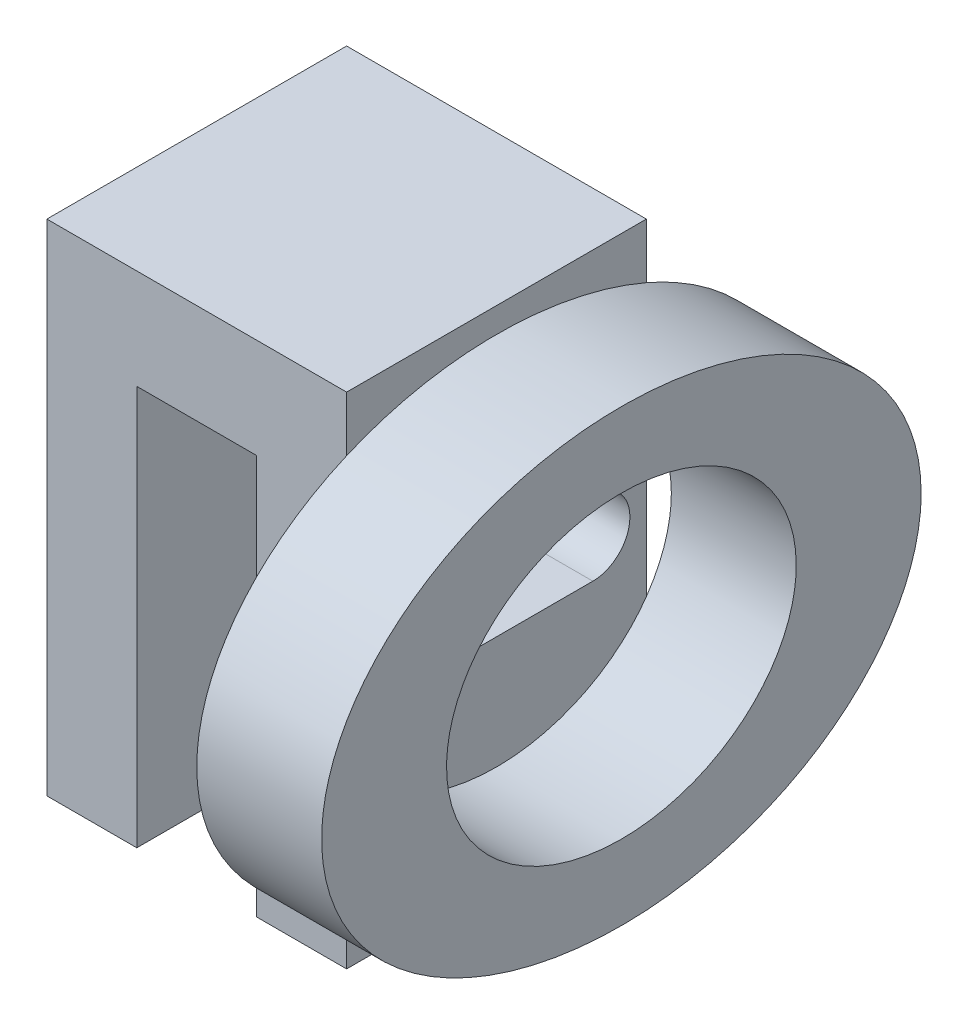
ISO-10303-21;
HEADER;
FILE_DESCRIPTION(('STEP AP214'),'2;1');
FILE_NAME('part.step','',(''),(''),'','','');
FILE_SCHEMA(('AUTOMOTIVE_DESIGN { 1 0 10303 214 1 1 1 1 }'));
ENDSEC;
DATA;
#1=APPLICATION_CONTEXT('core data for automotive mechanical design processes');
#2=APPLICATION_PROTOCOL_DEFINITION('international standard','automotive_design',2000,#1);
#3=PRODUCT_CONTEXT('',#1,'mechanical');
#4=PRODUCT('Part','Part','',(#3));
#5=PRODUCT_RELATED_PRODUCT_CATEGORY('part','',(#4));
#6=PRODUCT_DEFINITION_FORMATION('','',#4);
#7=PRODUCT_DEFINITION_CONTEXT('part definition',#1,'design');
#8=PRODUCT_DEFINITION('design','',#6,#7);
#9=PRODUCT_DEFINITION_SHAPE('','',#8);
#10=(LENGTH_UNIT() NAMED_UNIT(*) SI_UNIT(.MILLI.,.METRE.));
#11=(NAMED_UNIT(*) PLANE_ANGLE_UNIT() SI_UNIT($,.RADIAN.));
#12=(NAMED_UNIT(*) SI_UNIT($,.STERADIAN.) SOLID_ANGLE_UNIT());
#13=UNCERTAINTY_MEASURE_WITH_UNIT(LENGTH_MEASURE(1.E-05),#10,'distance_accuracy_value','');
#14=(GEOMETRIC_REPRESENTATION_CONTEXT(3) GLOBAL_UNCERTAINTY_ASSIGNED_CONTEXT((#13)) GLOBAL_UNIT_ASSIGNED_CONTEXT((#10,
#11,#12)) REPRESENTATION_CONTEXT('',''));
#15=CARTESIAN_POINT('',(0.,0.,0.));
#16=DIRECTION('',(0.,0.,1.));
#17=DIRECTION('',(1.,0.,0.));
#18=AXIS2_PLACEMENT_3D('',#15,#16,#17);
#19=CARTESIAN_POINT('',(0.88785046728972,10.,1.50467289719626));
#20=DIRECTION('',(-1.,0.,0.));
#21=DIRECTION('',(0.,0.,1.));
#22=AXIS2_PLACEMENT_3D('',#19,#20,#21);
#23=PLANE('',#22);
#24=CARTESIAN_POINT('',(0.88785046728972,5.,-1.49532710280374));
#25=DIRECTION('',(1.,0.,0.));
#26=DIRECTION('',(0.,0.,-1.));
#27=AXIS2_PLACEMENT_3D('',#24,#25,#26);
#28=ELLIPSE('',#27,6.,4.5);
#29=CARTESIAN_POINT('',(0.88785046728972,8.89711431702997,-4.49532710280374));
#30=VERTEX_POINT('',#29);
#31=CARTESIAN_POINT('',(0.88785046728972,8.89711431702997,1.50467289719626));
#32=VERTEX_POINT('',#31);
#33=EDGE_CURVE('E240',#30,#32,#28,.T.);
#34=ORIENTED_EDGE('',*,*,#33,.F.);
#35=DIRECTION('',(0.,-1.,0.));
#36=VECTOR('',#35,1.);
#37=CARTESIAN_POINT('',(0.88785046728972,10.,-4.49532710280374));
#38=LINE('',#37,#36);
#39=CARTESIAN_POINT('',(0.88785046728972,10.,-4.49532710280374));
#40=VERTEX_POINT('',#39);
#41=EDGE_CURVE('E304',#40,#30,#38,.T.);
#42=ORIENTED_EDGE('',*,*,#41,.F.);
#43=DIRECTION('',(0.,0.,-1.));
#44=VECTOR('',#43,1.);
#45=CARTESIAN_POINT('',(0.88785046728972,10.,1.50467289719626));
#46=LINE('',#45,#44);
#47=CARTESIAN_POINT('',(0.88785046728972,10.,1.50467289719626));
#48=VERTEX_POINT('',#47);
#49=EDGE_CURVE('E285',#48,#40,#46,.T.);
#50=ORIENTED_EDGE('',*,*,#49,.F.);
#51=DIRECTION('',(0.,-1.,0.));
#52=VECTOR('',#51,1.);
#53=CARTESIAN_POINT('',(0.88785046728972,10.,1.50467289719626));
#54=LINE('',#53,#52);
#55=EDGE_CURVE('E311',#48,#32,#54,.T.);
#56=ORIENTED_EDGE('',*,*,#55,.T.);
#57=EDGE_LOOP('',(#34,#42,#50,#56));
#58=FACE_BOUND('',#57,.T.);
#59=ADVANCED_FACE('F39',(#58),#23,.F.);
#60=CARTESIAN_POINT('',(0.,0.,0.));
#61=DIRECTION('',(0.,1.,0.));
#62=DIRECTION('',(0.,0.,1.));
#63=AXIS2_PLACEMENT_3D('',#60,#61,#62);
#64=PLANE('',#63);
#65=DIRECTION('',(-1.,0.,0.));
#66=VECTOR('',#65,1.);
#67=CARTESIAN_POINT('',(0.88785046728972,0.,-4.49532710280374));
#68=LINE('',#67,#66);
#69=CARTESIAN_POINT('',(-3.31214953271028,0.,-4.49532710280374));
#70=VERTEX_POINT('',#69);
#71=CARTESIAN_POINT('',(-5.11214953271028,0.,-4.49532710280374));
#72=VERTEX_POINT('',#71);
#73=EDGE_CURVE('E273',#70,#72,#68,.T.);
#74=ORIENTED_EDGE('',*,*,#73,.F.);
#75=DIRECTION('',(0.,0.,1.));
#76=VECTOR('',#75,1.);
#77=CARTESIAN_POINT('',(-3.31214953271028,0.,0.));
#78=LINE('',#77,#76);
#79=CARTESIAN_POINT('',(-3.31214953271028,0.,1.50467289719626));
#80=VERTEX_POINT('',#79);
#81=EDGE_CURVE('E328',#70,#80,#78,.T.);
#82=ORIENTED_EDGE('',*,*,#81,.T.);
#83=DIRECTION('',(1.,0.,0.));
#84=VECTOR('',#83,1.);
#85=CARTESIAN_POINT('',(-5.11214953271028,0.,1.50467289719626));
#86=LINE('',#85,#84);
#87=CARTESIAN_POINT('',(-5.11214953271028,0.,1.50467289719626));
#88=VERTEX_POINT('',#87);
#89=EDGE_CURVE('E297',#88,#80,#86,.T.);
#90=ORIENTED_EDGE('',*,*,#89,.F.);
#91=DIRECTION('',(0.,0.,1.));
#92=VECTOR('',#91,1.);
#93=CARTESIAN_POINT('',(-5.11214953271028,0.,-4.49532710280374));
#94=LINE('',#93,#92);
#95=EDGE_CURVE('E293',#72,#88,#94,.T.);
#96=ORIENTED_EDGE('',*,*,#95,.F.);
#97=EDGE_LOOP('',(#74,#82,#90,#96));
#98=FACE_BOUND('',#97,.T.);
#99=ADVANCED_FACE('F377',(#98),#64,.F.);
#100=CARTESIAN_POINT('',(0.88785046728972,10.,-4.49532710280374));
#101=DIRECTION('',(0.,0.,1.));
#102=DIRECTION('',(1.,0.,0.));
#103=AXIS2_PLACEMENT_3D('',#100,#101,#102);
#104=PLANE('',#103);
#105=DIRECTION('',(-1.,0.,0.));
#106=VECTOR('',#105,1.);
#107=CARTESIAN_POINT('',(0.88785046728972,8.,-4.49532710280374));
#108=LINE('',#107,#106);
#109=CARTESIAN_POINT('',(-0.91214953271028,8.,-4.49532710280374));
#110=VERTEX_POINT('',#109);
#111=CARTESIAN_POINT('',(-3.31214953271028,8.,-4.49532710280374));
#112=VERTEX_POINT('',#111);
#113=EDGE_CURVE('E269',#110,#112,#108,.T.);
#114=ORIENTED_EDGE('',*,*,#113,.T.);
#115=DIRECTION('',(0.,-1.,0.));
#116=VECTOR('',#115,1.);
#117=CARTESIAN_POINT('',(-3.31214953271028,10.,-4.49532710280374));
#118=LINE('',#117,#116);
#119=EDGE_CURVE('E265',#112,#70,#118,.T.);
#120=ORIENTED_EDGE('',*,*,#119,.T.);
#121=ORIENTED_EDGE('',*,*,#73,.T.);
#122=DIRECTION('',(0.,-1.,0.));
#123=VECTOR('',#122,1.);
#124=CARTESIAN_POINT('',(-5.11214953271028,10.,-4.49532710280374));
#125=LINE('',#124,#123);
#126=CARTESIAN_POINT('',(-5.11214953271028,10.,-4.49532710280374));
#127=VERTEX_POINT('',#126);
#128=EDGE_CURVE('E321',#127,#72,#125,.T.);
#129=ORIENTED_EDGE('',*,*,#128,.F.);
#130=DIRECTION('',(-1.,0.,0.));
#131=VECTOR('',#130,1.);
#132=CARTESIAN_POINT('',(0.88785046728972,10.,-4.49532710280374));
#133=LINE('',#132,#131);
#134=EDGE_CURVE('E274',#40,#127,#133,.T.);
#135=ORIENTED_EDGE('',*,*,#134,.F.);
#136=ORIENTED_EDGE('',*,*,#41,.T.);
#137=CARTESIAN_POINT('',(0.88785046728972,6.54523626091314,-4.49532710280374));
#138=VERTEX_POINT('',#137);
#139=EDGE_CURVE('E309',#30,#138,#38,.T.);
#140=ORIENTED_EDGE('',*,*,#139,.T.);
#141=CARTESIAN_POINT('',(0.887850467289719,3.45476373908686,-4.49532710280374));
#142=VERTEX_POINT('',#141);
#143=EDGE_CURVE('E350',#138,#142,#38,.T.);
#144=ORIENTED_EDGE('',*,*,#143,.T.);
#145=CARTESIAN_POINT('',(0.88785046728972,1.10288568297003,-4.49532710280374));
#146=VERTEX_POINT('',#145);
#147=EDGE_CURVE('E310',#142,#146,#38,.T.);
#148=ORIENTED_EDGE('',*,*,#147,.T.);
#149=CARTESIAN_POINT('',(0.88785046728972,0.,-4.49532710280374));
#150=VERTEX_POINT('',#149);
#151=EDGE_CURVE('E288',#146,#150,#38,.T.);
#152=ORIENTED_EDGE('',*,*,#151,.T.);
#153=CARTESIAN_POINT('',(-0.912149532710279,0.,-4.49532710280374));
#154=VERTEX_POINT('',#153);
#155=EDGE_CURVE('E289',#150,#154,#68,.T.);
#156=ORIENTED_EDGE('',*,*,#155,.T.);
#157=DIRECTION('',(0.,1.,0.));
#158=VECTOR('',#157,1.);
#159=CARTESIAN_POINT('',(-0.912149532710281,10.,-4.49532710280374));
#160=LINE('',#159,#158);
#161=EDGE_CURVE('E259',#154,#110,#160,.T.);
#162=ORIENTED_EDGE('',*,*,#161,.T.);
#163=EDGE_LOOP('',(#114,#120,#121,#129,#135,#136,#140,#144,#148,#152,#156,#162));
#164=FACE_BOUND('',#163,.T.);
#165=ADVANCED_FACE('F41',(#164),#104,.F.);
#166=CARTESIAN_POINT('',(-5.11214953271028,10.,-4.49532710280374));
#167=DIRECTION('',(1.,0.,0.));
#168=DIRECTION('',(0.,0.,-1.));
#169=AXIS2_PLACEMENT_3D('',#166,#167,#168);
#170=PLANE('',#169);
#171=ORIENTED_EDGE('',*,*,#95,.T.);
#172=DIRECTION('',(0.,-1.,0.));
#173=VECTOR('',#172,1.);
#174=CARTESIAN_POINT('',(-5.11214953271028,10.,1.50467289719626));
#175=LINE('',#174,#173);
#176=CARTESIAN_POINT('',(-5.11214953271028,10.,1.50467289719626));
#177=VERTEX_POINT('',#176);
#178=EDGE_CURVE('E315',#177,#88,#175,.T.);
#179=ORIENTED_EDGE('',*,*,#178,.F.);
#180=DIRECTION('',(0.,0.,1.));
#181=VECTOR('',#180,1.);
#182=CARTESIAN_POINT('',(-5.11214953271028,10.,-4.49532710280374));
#183=LINE('',#182,#181);
#184=EDGE_CURVE('E278',#127,#177,#183,.T.);
#185=ORIENTED_EDGE('',*,*,#184,.F.);
#186=ORIENTED_EDGE('',*,*,#128,.T.);
#187=EDGE_LOOP('',(#171,#179,#185,#186));
#188=FACE_BOUND('',#187,.T.);
#189=ADVANCED_FACE('F387',(#188),#170,.F.);
#190=CARTESIAN_POINT('',(-5.11214953271028,10.,1.50467289719626));
#191=DIRECTION('',(0.,0.,-1.));
#192=DIRECTION('',(-1.,0.,0.));
#193=AXIS2_PLACEMENT_3D('',#190,#191,#192);
#194=PLANE('',#193);
#195=ORIENTED_EDGE('',*,*,#89,.T.);
#196=DIRECTION('',(0.,-1.,0.));
#197=VECTOR('',#196,1.);
#198=CARTESIAN_POINT('',(-3.31214953271028,0.,1.50467289719626));
#199=LINE('',#198,#197);
#200=CARTESIAN_POINT('',(-3.31214953271028,8.,1.50467289719626));
#201=VERTEX_POINT('',#200);
#202=EDGE_CURVE('E252',#201,#80,#199,.T.);
#203=ORIENTED_EDGE('',*,*,#202,.F.);
#204=DIRECTION('',(-1.,0.,0.));
#205=VECTOR('',#204,1.);
#206=CARTESIAN_POINT('',(-3.31214953271028,8.,1.50467289719626));
#207=LINE('',#206,#205);
#208=CARTESIAN_POINT('',(-0.91214953271028,8.,1.50467289719626));
#209=VERTEX_POINT('',#208);
#210=EDGE_CURVE('E248',#209,#201,#207,.T.);
#211=ORIENTED_EDGE('',*,*,#210,.F.);
#212=DIRECTION('',(0.,1.,0.));
#213=VECTOR('',#212,1.);
#214=CARTESIAN_POINT('',(-0.91214953271028,8.,1.50467289719626));
#215=LINE('',#214,#213);
#216=CARTESIAN_POINT('',(-0.912149532710279,0.,1.50467289719626));
#217=VERTEX_POINT('',#216);
#218=EDGE_CURVE('E239',#217,#209,#215,.T.);
#219=ORIENTED_EDGE('',*,*,#218,.F.);
#220=CARTESIAN_POINT('',(0.88785046728972,0.,1.50467289719626));
#221=VERTEX_POINT('',#220);
#222=EDGE_CURVE('E296',#217,#221,#86,.T.);
#223=ORIENTED_EDGE('',*,*,#222,.T.);
#224=CARTESIAN_POINT('',(0.88785046728972,1.10288568297003,1.50467289719626));
#225=VERTEX_POINT('',#224);
#226=EDGE_CURVE('E308',#225,#221,#54,.T.);
#227=ORIENTED_EDGE('',*,*,#226,.F.);
#228=CARTESIAN_POINT('',(0.88785046728972,3.45476373908687,1.50467289719626));
#229=VERTEX_POINT('',#228);
#230=EDGE_CURVE('E317',#229,#225,#54,.T.);
#231=ORIENTED_EDGE('',*,*,#230,.F.);
#232=CARTESIAN_POINT('',(0.887850467289719,6.54523626091314,1.50467289719626));
#233=VERTEX_POINT('',#232);
#234=EDGE_CURVE('E399',#233,#229,#54,.T.);
#235=ORIENTED_EDGE('',*,*,#234,.F.);
#236=EDGE_CURVE('E316',#32,#233,#54,.T.);
#237=ORIENTED_EDGE('',*,*,#236,.F.);
#238=ORIENTED_EDGE('',*,*,#55,.F.);
#239=DIRECTION('',(1.,0.,0.));
#240=VECTOR('',#239,1.);
#241=CARTESIAN_POINT('',(-5.11214953271028,10.,1.50467289719626));
#242=LINE('',#241,#240);
#243=EDGE_CURVE('E282',#177,#48,#242,.T.);
#244=ORIENTED_EDGE('',*,*,#243,.F.);
#245=ORIENTED_EDGE('',*,*,#178,.T.);
#246=EDGE_LOOP('',(#195,#203,#211,#219,#223,#227,#231,#235,#237,#238,#244,#245));
#247=FACE_BOUND('',#246,.T.);
#248=ADVANCED_FACE('F381',(#247),#194,.F.);
#249=EDGE_CURVE('E48',#225,#146,#28,.T.);
#250=ORIENTED_EDGE('',*,*,#249,.F.);
#251=ORIENTED_EDGE('',*,*,#226,.T.);
#252=DIRECTION('',(0.,0.,-1.));
#253=VECTOR('',#252,1.);
#254=CARTESIAN_POINT('',(0.88785046728972,0.,1.50467289719626));
#255=LINE('',#254,#253);
#256=EDGE_CURVE('E279',#221,#150,#255,.T.);
#257=ORIENTED_EDGE('',*,*,#256,.T.);
#258=ORIENTED_EDGE('',*,*,#151,.F.);
#259=EDGE_LOOP('',(#250,#251,#257,#258));
#260=FACE_BOUND('',#259,.T.);
#261=ADVANCED_FACE('F357',(#260),#23,.F.);
#262=CARTESIAN_POINT('',(0.,10.,0.));
#263=DIRECTION('',(0.,1.,0.));
#264=DIRECTION('',(0.,0.,1.));
#265=AXIS2_PLACEMENT_3D('',#262,#263,#264);
#266=PLANE('',#265);
#267=ORIENTED_EDGE('',*,*,#134,.T.);
#268=ORIENTED_EDGE('',*,*,#184,.T.);
#269=ORIENTED_EDGE('',*,*,#243,.T.);
#270=ORIENTED_EDGE('',*,*,#49,.T.);
#271=EDGE_LOOP('',(#267,#268,#269,#270));
#272=FACE_BOUND('',#271,.T.);
#273=ADVANCED_FACE('F391',(#272),#266,.T.);
#274=ORIENTED_EDGE('',*,*,#222,.F.);
#275=DIRECTION('',(0.,0.,-1.));
#276=VECTOR('',#275,1.);
#277=CARTESIAN_POINT('',(-0.912149532710279,0.,0.));
#278=LINE('',#277,#276);
#279=EDGE_CURVE('E325',#217,#154,#278,.T.);
#280=ORIENTED_EDGE('',*,*,#279,.T.);
#281=ORIENTED_EDGE('',*,*,#155,.F.);
#282=ORIENTED_EDGE('',*,*,#256,.F.);
#283=EDGE_LOOP('',(#274,#280,#281,#282));
#284=FACE_BOUND('',#283,.T.);
#285=ADVANCED_FACE('F364',(#284),#64,.F.);
#286=CARTESIAN_POINT('',(-3.31214953271028,8.,-8.49532710280374));
#287=DIRECTION('',(0.,1.,0.));
#288=DIRECTION('',(0.,0.,1.));
#289=AXIS2_PLACEMENT_3D('',#286,#287,#288);
#290=PLANE('',#289);
#291=DIRECTION('',(0.,0.,1.));
#292=VECTOR('',#291,1.);
#293=CARTESIAN_POINT('',(-0.91214953271028,8.,-8.49532710280374));
#294=LINE('',#293,#292);
#295=EDGE_CURVE('E255',#110,#209,#294,.T.);
#296=ORIENTED_EDGE('',*,*,#295,.T.);
#297=ORIENTED_EDGE('',*,*,#210,.T.);
#298=DIRECTION('',(0.,0.,1.));
#299=VECTOR('',#298,1.);
#300=CARTESIAN_POINT('',(-3.31214953271028,8.,-8.49532710280374));
#301=LINE('',#300,#299);
#302=EDGE_CURVE('E256',#112,#201,#301,.T.);
#303=ORIENTED_EDGE('',*,*,#302,.F.);
#304=ORIENTED_EDGE('',*,*,#113,.F.);
#305=EDGE_LOOP('',(#296,#297,#303,#304));
#306=FACE_BOUND('',#305,.T.);
#307=ADVANCED_FACE('F371',(#306),#290,.F.);
#308=CARTESIAN_POINT('',(-3.31214953271028,0.,-8.49532710280374));
#309=DIRECTION('',(-1.,0.,0.));
#310=DIRECTION('',(0.,0.,1.));
#311=AXIS2_PLACEMENT_3D('',#308,#309,#310);
#312=PLANE('',#311);
#313=ORIENTED_EDGE('',*,*,#302,.T.);
#314=ORIENTED_EDGE('',*,*,#202,.T.);
#315=ORIENTED_EDGE('',*,*,#81,.F.);
#316=ORIENTED_EDGE('',*,*,#119,.F.);
#317=EDGE_LOOP('',(#313,#314,#315,#316));
#318=FACE_BOUND('',#317,.T.);
#319=ADVANCED_FACE('F232',(#318),#312,.F.);
#320=CARTESIAN_POINT('',(-0.91214953271028,8.,-8.49532710280374));
#321=DIRECTION('',(1.,0.,0.));
#322=DIRECTION('',(0.,1.,0.));
#323=AXIS2_PLACEMENT_3D('',#320,#321,#322);
#324=PLANE('',#323);
#325=DIRECTION('',(0.,0.,1.));
#326=VECTOR('',#325,1.);
#327=CARTESIAN_POINT('',(-0.91214953271028,5.74198718792735,-8.49532710280373));
#328=LINE('',#327,#326);
#329=CARTESIAN_POINT('',(-0.91214953271028,5.74198718792737,-3.42416427291218));
#330=VERTEX_POINT('',#329);
#331=CARTESIAN_POINT('',(-0.91214953271028,5.74198718792738,0.46712499236865));
#332=VERTEX_POINT('',#331);
#333=EDGE_CURVE('E193',#330,#332,#328,.T.);
#334=ORIENTED_EDGE('',*,*,#333,.T.);
#335=CARTESIAN_POINT('',(-0.91214953271028,5.,0.46712499236865));
#336=DIRECTION('',(1.,0.,0.));
#337=DIRECTION('',(0.,1.,0.));
#338=AXIS2_PLACEMENT_3D('',#335,#336,#337);
#339=CIRCLE('',#338,0.741987187927382);
#340=CARTESIAN_POINT('',(-0.91214953271028,4.25801281207262,0.46712499236865));
#341=VERTEX_POINT('',#340);
#342=EDGE_CURVE('E197',#332,#341,#339,.T.);
#343=ORIENTED_EDGE('',*,*,#342,.T.);
#344=DIRECTION('',(0.,0.,-1.));
#345=VECTOR('',#344,1.);
#346=CARTESIAN_POINT('',(-0.91214953271028,4.25801281207265,-8.49532710280375));
#347=LINE('',#346,#345);
#348=CARTESIAN_POINT('',(-0.91214953271028,4.25801281207263,-3.42416427291218));
#349=VERTEX_POINT('',#348);
#350=EDGE_CURVE('E184',#341,#349,#347,.T.);
#351=ORIENTED_EDGE('',*,*,#350,.T.);
#352=CARTESIAN_POINT('',(-0.91214953271028,5.,-3.42416427291218));
#353=DIRECTION('',(1.,0.,0.));
#354=DIRECTION('',(0.,1.,0.));
#355=AXIS2_PLACEMENT_3D('',#352,#353,#354);
#356=CIRCLE('',#355,0.741987187927369);
#357=EDGE_CURVE('E159',#349,#330,#356,.T.);
#358=ORIENTED_EDGE('',*,*,#357,.T.);
#359=EDGE_LOOP('',(#334,#343,#351,#358));
#360=FACE_BOUND('',#359,.T.);
#361=ORIENTED_EDGE('',*,*,#279,.F.);
#362=ORIENTED_EDGE('',*,*,#218,.T.);
#363=ORIENTED_EDGE('',*,*,#295,.F.);
#364=ORIENTED_EDGE('',*,*,#161,.F.);
#365=EDGE_LOOP('',(#361,#362,#363,#364));
#366=FACE_BOUND('',#365,.T.);
#367=ADVANCED_FACE('F367',(#360,#366),#324,.F.);
#368=CARTESIAN_POINT('',(0.88785046728972,5.,-1.49532710280374));
#369=DIRECTION('',(1.,0.,0.));
#370=DIRECTION('',(0.,0.,-1.));
#371=AXIS2_PLACEMENT_3D('',#368,#369,#370);
#372=PLANE('',#371);
#373=ORIENTED_EDGE('',*,*,#236,.T.);
#374=CARTESIAN_POINT('',(0.887850467289719,5.,-1.49532710280374));
#375=DIRECTION('',(1.,0.,0.));
#376=DIRECTION('',(0.,0.,-1.));
#377=AXIS2_PLACEMENT_3D('',#374,#375,#376);
#378=ELLIPSE('',#377,3.5,3.);
#379=EDGE_CURVE('E208',#233,#229,#378,.T.);
#380=ORIENTED_EDGE('',*,*,#379,.T.);
#381=ORIENTED_EDGE('',*,*,#230,.T.);
#382=EDGE_CURVE('E244',#32,#225,#28,.T.);
#383=ORIENTED_EDGE('',*,*,#382,.F.);
#384=EDGE_LOOP('',(#373,#380,#381,#383));
#385=FACE_BOUND('',#384,.T.);
#386=ADVANCED_FACE('F228',(#385),#372,.F.);
#387=CARTESIAN_POINT('',(3.38785046728972,5.,-1.49532710280374));
#388=DIRECTION('',(1.,0.,0.));
#389=DIRECTION('',(0.,0.,-1.));
#390=AXIS2_PLACEMENT_3D('',#387,#388,#389);
#391=ELLIPSE('',#390,6.,4.5);
#392=DIRECTION('',(-1.,0.,0.));
#393=VECTOR('',#392,1.);
#394=SURFACE_OF_LINEAR_EXTRUSION('',#391,#393);
#395=CARTESIAN_POINT('',(3.38785046728972,5.,-7.49532710280374));
#396=VERTEX_POINT('',#395);
#397=EDGE_CURVE('E234',#396,#396,#391,.T.);
#398=ORIENTED_EDGE('',*,*,#397,.F.);
#399=EDGE_LOOP('',(#398));
#400=FACE_BOUND('',#399,.T.);
#401=ORIENTED_EDGE('',*,*,#33,.T.);
#402=ORIENTED_EDGE('',*,*,#382,.T.);
#403=ORIENTED_EDGE('',*,*,#249,.T.);
#404=EDGE_CURVE('E207',#146,#30,#28,.T.);
#405=ORIENTED_EDGE('',*,*,#404,.T.);
#406=EDGE_LOOP('',(#401,#402,#403,#405));
#407=FACE_BOUND('',#406,.T.);
#408=ADVANCED_FACE('F223',(#400,#407),#394,.F.);
#409=CARTESIAN_POINT('',(3.38785046728972,5.,-1.49532710280374));
#410=DIRECTION('',(1.,0.,0.));
#411=DIRECTION('',(0.,0.,-1.));
#412=AXIS2_PLACEMENT_3D('',#409,#410,#411);
#413=PLANE('',#412);
#414=CARTESIAN_POINT('',(3.38785046728972,5.,-1.49532710280374));
#415=DIRECTION('',(1.,0.,0.));
#416=DIRECTION('',(0.,0.,-1.));
#417=AXIS2_PLACEMENT_3D('',#414,#415,#416);
#418=ELLIPSE('',#417,3.5,3.);
#419=CARTESIAN_POINT('',(3.38785046728972,5.,-4.99532710280374));
#420=VERTEX_POINT('',#419);
#421=EDGE_CURVE('E201',#420,#420,#418,.T.);
#422=ORIENTED_EDGE('',*,*,#421,.F.);
#423=EDGE_LOOP('',(#422));
#424=FACE_BOUND('',#423,.T.);
#425=ORIENTED_EDGE('',*,*,#397,.T.);
#426=EDGE_LOOP('',(#425));
#427=FACE_BOUND('',#426,.T.);
#428=ADVANCED_FACE('F219',(#424,#427),#413,.T.);
#429=ORIENTED_EDGE('',*,*,#147,.F.);
#430=CARTESIAN_POINT('',(0.88785046728972,5.,-1.49532710280374));
#431=DIRECTION('',(1.,0.,0.));
#432=DIRECTION('',(0.,0.,-1.));
#433=AXIS2_PLACEMENT_3D('',#430,#431,#432);
#434=ELLIPSE('',#433,3.5,3.);
#435=EDGE_CURVE('E11',#142,#138,#434,.T.);
#436=ORIENTED_EDGE('',*,*,#435,.T.);
#437=ORIENTED_EDGE('',*,*,#139,.F.);
#438=ORIENTED_EDGE('',*,*,#404,.F.);
#439=EDGE_LOOP('',(#429,#436,#437,#438));
#440=FACE_BOUND('',#439,.T.);
#441=ADVANCED_FACE('F222',(#440),#372,.F.);
#442=CARTESIAN_POINT('',(0.887850467289719,5.,-1.49532710280374));
#443=DIRECTION('',(1.,0.,0.));
#444=DIRECTION('',(0.,0.,-1.));
#445=AXIS2_PLACEMENT_3D('',#442,#443,#444);
#446=PLANE('',#445);
#447=CARTESIAN_POINT('',(0.887850467289719,5.,0.46712499236865));
#448=DIRECTION('',(1.,0.,0.));
#449=DIRECTION('',(0.,0.,-1.));
#450=AXIS2_PLACEMENT_3D('',#447,#448,#449);
#451=CIRCLE('',#450,0.741987187927382);
#452=CARTESIAN_POINT('',(0.887850467289719,5.74198718792738,0.46712499236865));
#453=VERTEX_POINT('',#452);
#454=CARTESIAN_POINT('',(0.887850467289719,4.25801281207262,0.46712499236865));
#455=VERTEX_POINT('',#454);
#456=EDGE_CURVE('E63',#453,#455,#451,.T.);
#457=ORIENTED_EDGE('',*,*,#456,.F.);
#458=DIRECTION('',(0.,0.,1.));
#459=VECTOR('',#458,1.);
#460=CARTESIAN_POINT('',(0.887850467289719,5.74198718792738,0.46712499236865));
#461=LINE('',#460,#459);
#462=CARTESIAN_POINT('',(0.887850467289719,5.74198718792737,-3.42416427291218));
#463=VERTEX_POINT('',#462);
#464=EDGE_CURVE('E174',#463,#453,#461,.T.);
#465=ORIENTED_EDGE('',*,*,#464,.F.);
#466=CARTESIAN_POINT('',(0.887850467289719,5.,-3.42416427291218));
#467=DIRECTION('',(1.,0.,0.));
#468=DIRECTION('',(0.,0.,-1.));
#469=AXIS2_PLACEMENT_3D('',#466,#467,#468);
#470=CIRCLE('',#469,0.741987187927369);
#471=CARTESIAN_POINT('',(0.887850467289719,4.25801281207263,-3.42416427291218));
#472=VERTEX_POINT('',#471);
#473=EDGE_CURVE('E156',#472,#463,#470,.T.);
#474=ORIENTED_EDGE('',*,*,#473,.F.);
#475=DIRECTION('',(0.,0.,-1.));
#476=VECTOR('',#475,1.);
#477=CARTESIAN_POINT('',(0.887850467289719,4.25801281207262,0.46712499236865));
#478=LINE('',#477,#476);
#479=EDGE_CURVE('E166',#455,#472,#478,.T.);
#480=ORIENTED_EDGE('',*,*,#479,.F.);
#481=EDGE_LOOP('',(#457,#465,#474,#480));
#482=FACE_BOUND('',#481,.T.);
#483=ORIENTED_EDGE('',*,*,#143,.F.);
#484=EDGE_CURVE('E202',#138,#233,#378,.T.);
#485=ORIENTED_EDGE('',*,*,#484,.T.);
#486=ORIENTED_EDGE('',*,*,#234,.T.);
#487=EDGE_CURVE('E209',#229,#142,#378,.T.);
#488=ORIENTED_EDGE('',*,*,#487,.T.);
#489=EDGE_LOOP('',(#483,#485,#486,#488));
#490=FACE_BOUND('',#489,.T.);
#491=ADVANCED_FACE('F171',(#482,#490),#446,.T.);
#492=DIRECTION('',(1.,0.,0.));
#493=VECTOR('',#492,1.);
#494=SURFACE_OF_LINEAR_EXTRUSION('',#378,#493);
#495=ORIENTED_EDGE('',*,*,#484,.F.);
#496=ORIENTED_EDGE('',*,*,#435,.F.);
#497=ORIENTED_EDGE('',*,*,#487,.F.);
#498=ORIENTED_EDGE('',*,*,#379,.F.);
#499=EDGE_LOOP('',(#495,#496,#497,#498));
#500=FACE_BOUND('',#499,.T.);
#501=ORIENTED_EDGE('',*,*,#421,.T.);
#502=EDGE_LOOP('',(#501));
#503=FACE_BOUND('',#502,.T.);
#504=ADVANCED_FACE('F212',(#500,#503),#494,.F.);
#505=CARTESIAN_POINT('',(-1.11214953271028,5.,0.46712499236865));
#506=DIRECTION('',(1.,0.,0.));
#507=DIRECTION('',(0.,0.,-1.));
#508=AXIS2_PLACEMENT_3D('',#505,#506,#507);
#509=CYLINDRICAL_SURFACE('',#508,0.741987187927382);
#510=DIRECTION('',(1.,0.,0.));
#511=VECTOR('',#510,1.);
#512=CARTESIAN_POINT('',(-1.11214953271028,5.74198718792738,0.46712499236865));
#513=LINE('',#512,#511);
#514=EDGE_CURVE('E181',#332,#453,#513,.T.);
#515=ORIENTED_EDGE('',*,*,#514,.T.);
#516=ORIENTED_EDGE('',*,*,#456,.T.);
#517=DIRECTION('',(1.,0.,0.));
#518=VECTOR('',#517,1.);
#519=CARTESIAN_POINT('',(-1.11214953271028,4.25801281207262,0.46712499236865));
#520=LINE('',#519,#518);
#521=EDGE_CURVE('E163',#341,#455,#520,.T.);
#522=ORIENTED_EDGE('',*,*,#521,.F.);
#523=ORIENTED_EDGE('',*,*,#342,.F.);
#524=EDGE_LOOP('',(#515,#516,#522,#523));
#525=FACE_BOUND('',#524,.T.);
#526=ADVANCED_FACE('F216',(#525),#509,.F.);
#527=CARTESIAN_POINT('',(-1.11214953271028,5.74198718792738,0.46712499236865));
#528=DIRECTION('',(0.,1.,0.));
#529=DIRECTION('',(0.,0.,1.));
#530=AXIS2_PLACEMENT_3D('',#527,#528,#529);
#531=PLANE('',#530);
#532=DIRECTION('',(1.,0.,0.));
#533=VECTOR('',#532,1.);
#534=CARTESIAN_POINT('',(-1.11214953271028,5.74198718792737,-3.42416427291218));
#535=LINE('',#534,#533);
#536=EDGE_CURVE('E162',#330,#463,#535,.T.);
#537=ORIENTED_EDGE('',*,*,#536,.T.);
#538=ORIENTED_EDGE('',*,*,#464,.T.);
#539=ORIENTED_EDGE('',*,*,#514,.F.);
#540=ORIENTED_EDGE('',*,*,#333,.F.);
#541=EDGE_LOOP('',(#537,#538,#539,#540));
#542=FACE_BOUND('',#541,.T.);
#543=ADVANCED_FACE('F522',(#542),#531,.F.);
#544=CARTESIAN_POINT('',(-1.11214953271028,5.,-3.42416427291218));
#545=DIRECTION('',(1.,0.,0.));
#546=DIRECTION('',(0.,0.,-1.));
#547=AXIS2_PLACEMENT_3D('',#544,#545,#546);
#548=CYLINDRICAL_SURFACE('',#547,0.741987187927369);
#549=DIRECTION('',(1.,0.,0.));
#550=VECTOR('',#549,1.);
#551=CARTESIAN_POINT('',(-1.11214953271028,4.25801281207263,-3.42416427291218));
#552=LINE('',#551,#550);
#553=EDGE_CURVE('E55',#349,#472,#552,.T.);
#554=ORIENTED_EDGE('',*,*,#553,.T.);
#555=ORIENTED_EDGE('',*,*,#473,.T.);
#556=ORIENTED_EDGE('',*,*,#536,.F.);
#557=ORIENTED_EDGE('',*,*,#357,.F.);
#558=EDGE_LOOP('',(#554,#555,#556,#557));
#559=FACE_BOUND('',#558,.T.);
#560=ADVANCED_FACE('F153',(#559),#548,.F.);
#561=CARTESIAN_POINT('',(-1.11214953271028,4.25801281207262,0.46712499236865));
#562=DIRECTION('',(0.,-1.,0.));
#563=DIRECTION('',(0.,0.,-1.));
#564=AXIS2_PLACEMENT_3D('',#561,#562,#563);
#565=PLANE('',#564);
#566=ORIENTED_EDGE('',*,*,#521,.T.);
#567=ORIENTED_EDGE('',*,*,#479,.T.);
#568=ORIENTED_EDGE('',*,*,#553,.F.);
#569=ORIENTED_EDGE('',*,*,#350,.F.);
#570=EDGE_LOOP('',(#566,#567,#568,#569));
#571=FACE_BOUND('',#570,.T.);
#572=ADVANCED_FACE('F167',(#571),#565,.F.);
#573=CLOSED_SHELL('',(#59,#99,#165,#189,#248,#261,#273,#285,#307,#319,#367,#386,#408,#428,#441,
#491,#504,#526,#543,#560,#572));
#574=MANIFOLD_SOLID_BREP('B2',#573);
#575=ADVANCED_BREP_SHAPE_REPRESENTATION('',(#18,#574),#14);
#576=SHAPE_DEFINITION_REPRESENTATION(#9,#575);
ENDSEC;
END-ISO-10303-21;
